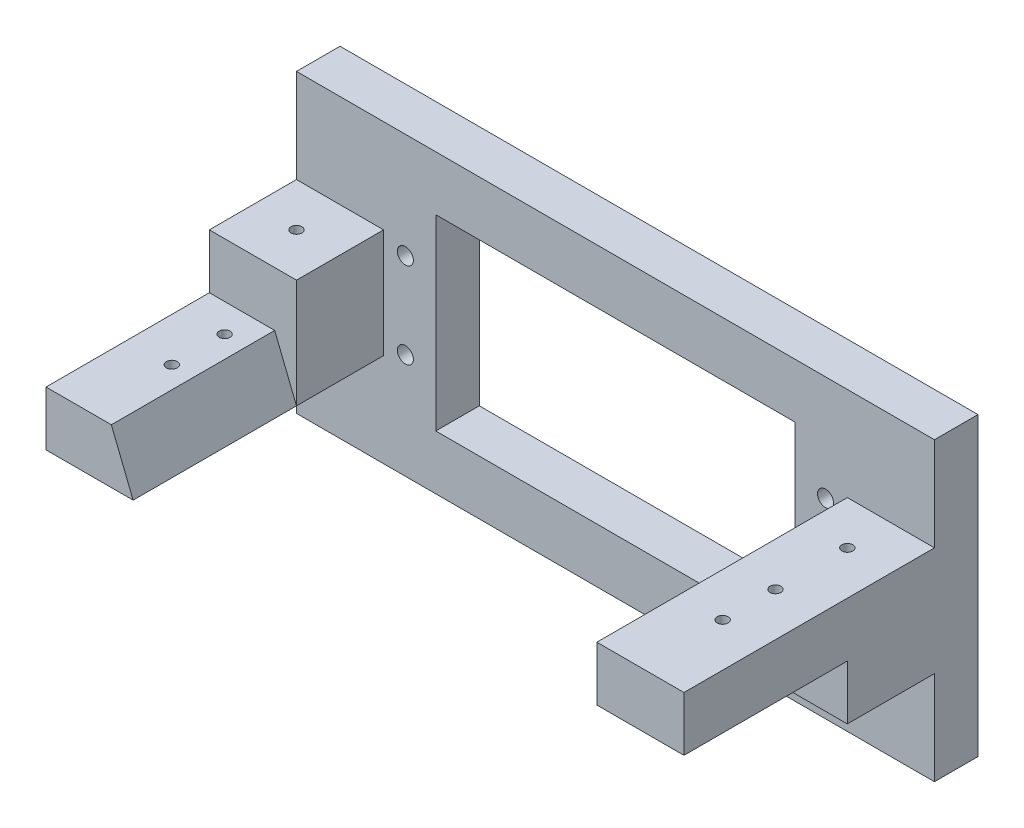
ISO-10303-21;
HEADER;
FILE_DESCRIPTION(('STEP AP214'),'2;1');
FILE_NAME('part.step','',(''),(''),'','','');
FILE_SCHEMA(('AUTOMOTIVE_DESIGN { 1 0 10303 214 1 1 1 1 }'));
ENDSEC;
DATA;
#1=APPLICATION_CONTEXT('core data for automotive mechanical design processes');
#2=APPLICATION_PROTOCOL_DEFINITION('international standard','automotive_design',2000,#1);
#3=PRODUCT_CONTEXT('',#1,'mechanical');
#4=PRODUCT('Part','Part','',(#3));
#5=PRODUCT_RELATED_PRODUCT_CATEGORY('part','',(#4));
#6=PRODUCT_DEFINITION_FORMATION('','',#4);
#7=PRODUCT_DEFINITION_CONTEXT('part definition',#1,'design');
#8=PRODUCT_DEFINITION('design','',#6,#7);
#9=PRODUCT_DEFINITION_SHAPE('','',#8);
#10=(LENGTH_UNIT() NAMED_UNIT(*) SI_UNIT(.MILLI.,.METRE.));
#11=(NAMED_UNIT(*) PLANE_ANGLE_UNIT() SI_UNIT($,.RADIAN.));
#12=(NAMED_UNIT(*) SI_UNIT($,.STERADIAN.) SOLID_ANGLE_UNIT());
#13=UNCERTAINTY_MEASURE_WITH_UNIT(LENGTH_MEASURE(1.E-05),#10,'distance_accuracy_value','');
#14=(GEOMETRIC_REPRESENTATION_CONTEXT(3) GLOBAL_UNCERTAINTY_ASSIGNED_CONTEXT((#13)) GLOBAL_UNIT_ASSIGNED_CONTEXT((#10,
#11,#12)) REPRESENTATION_CONTEXT('',''));
#15=CARTESIAN_POINT('',(0.,0.,0.));
#16=DIRECTION('',(0.,0.,1.));
#17=DIRECTION('',(1.,0.,0.));
#18=AXIS2_PLACEMENT_3D('',#15,#16,#17);
#19=CARTESIAN_POINT('',(0.,0.,15.24));
#20=DIRECTION('',(0.,0.,-1.));
#21=DIRECTION('',(-1.,0.,0.));
#22=AXIS2_PLACEMENT_3D('',#19,#20,#21);
#23=PLANE('',#22);
#24=DIRECTION('',(1.,0.,0.));
#25=VECTOR('',#24,1.);
#26=CARTESIAN_POINT('',(54.34457,23.622,15.24));
#27=LINE('',#26,#25);
#28=CARTESIAN_POINT('',(54.34457,23.622,15.24));
#29=VERTEX_POINT('',#28);
#30=CARTESIAN_POINT('',(64.50457,23.622,15.24));
#31=VERTEX_POINT('',#30);
#32=EDGE_CURVE('E63',#29,#31,#27,.T.);
#33=ORIENTED_EDGE('',*,*,#32,.F.);
#34=DIRECTION('',(0.,-1.,0.));
#35=VECTOR('',#34,1.);
#36=CARTESIAN_POINT('',(54.34457,17.272,15.24));
#37=LINE('',#36,#35);
#38=CARTESIAN_POINT('',(54.34457,17.272,15.24));
#39=VERTEX_POINT('',#38);
#40=EDGE_CURVE('E220',#29,#39,#37,.T.);
#41=ORIENTED_EDGE('',*,*,#40,.T.);
#42=DIRECTION('',(1.,0.,0.));
#43=VECTOR('',#42,1.);
#44=CARTESIAN_POINT('',(54.34457,17.272,15.24));
#45=LINE('',#44,#43);
#46=CARTESIAN_POINT('',(64.50457,17.272,15.24));
#47=VERTEX_POINT('',#46);
#48=EDGE_CURVE('E229',#39,#47,#45,.T.);
#49=ORIENTED_EDGE('',*,*,#48,.T.);
#50=DIRECTION('',(0.,1.,0.));
#51=VECTOR('',#50,1.);
#52=CARTESIAN_POINT('',(64.50457,17.272,15.24));
#53=LINE('',#52,#51);
#54=EDGE_CURVE('E217',#47,#31,#53,.T.);
#55=ORIENTED_EDGE('',*,*,#54,.T.);
#56=EDGE_LOOP('',(#33,#41,#49,#55));
#57=FACE_BOUND('',#56,.T.);
#58=ADVANCED_FACE('F37',(#57),#23,.F.);
#59=CARTESIAN_POINT('',(0.,0.,15.24));
#60=DIRECTION('',(0.,0.,-1.));
#61=DIRECTION('',(-1.,0.,0.));
#62=AXIS2_PLACEMENT_3D('',#59,#60,#61);
#63=PLANE('',#62);
#64=DIRECTION('',(-1.,0.,0.));
#65=VECTOR('',#64,1.);
#66=CARTESIAN_POINT('',(-9.89457000000001,23.622,15.24));
#67=LINE('',#66,#65);
#68=CARTESIAN_POINT('',(-2.27457,23.622,15.24));
#69=VERTEX_POINT('',#68);
#70=CARTESIAN_POINT('',(-9.89457000000001,23.622,15.24));
#71=VERTEX_POINT('',#70);
#72=EDGE_CURVE('E41',#69,#71,#67,.T.);
#73=ORIENTED_EDGE('',*,*,#72,.F.);
#74=DIRECTION('',(0.371390676354104,-0.928476690885259,0.));
#75=VECTOR('',#74,1.);
#76=CARTESIAN_POINT('',(0.265429999999999,17.272,15.24));
#77=LINE('',#76,#75);
#78=CARTESIAN_POINT('',(0.265429999999999,17.272,15.24));
#79=VERTEX_POINT('',#78);
#80=EDGE_CURVE('E178',#69,#79,#77,.T.);
#81=ORIENTED_EDGE('',*,*,#80,.T.);
#82=DIRECTION('',(0.,1.,0.));
#83=VECTOR('',#82,1.);
#84=CARTESIAN_POINT('',(0.265429999999999,17.272,15.24));
#85=LINE('',#84,#83);
#86=CARTESIAN_POINT('',(0.265429999999999,29.972,15.24));
#87=VERTEX_POINT('',#86);
#88=EDGE_CURVE('E212',#79,#87,#85,.T.);
#89=ORIENTED_EDGE('',*,*,#88,.T.);
#90=DIRECTION('',(-1.,0.,0.));
#91=VECTOR('',#90,1.);
#92=CARTESIAN_POINT('',(-9.89457000000001,29.972,15.24));
#93=LINE('',#92,#91);
#94=CARTESIAN_POINT('',(-9.89457000000001,29.972,15.24));
#95=VERTEX_POINT('',#94);
#96=EDGE_CURVE('E266',#87,#95,#93,.T.);
#97=ORIENTED_EDGE('',*,*,#96,.T.);
#98=DIRECTION('',(0.,-1.,0.));
#99=VECTOR('',#98,1.);
#100=CARTESIAN_POINT('',(-9.89457,17.272,15.24));
#101=LINE('',#100,#99);
#102=EDGE_CURVE('E197',#95,#71,#101,.T.);
#103=ORIENTED_EDGE('',*,*,#102,.T.);
#104=EDGE_LOOP('',(#73,#81,#89,#97,#103));
#105=FACE_BOUND('',#104,.T.);
#106=ADVANCED_FACE('F195',(#105),#63,.F.);
#107=CARTESIAN_POINT('',(0.,0.,5.08));
#108=DIRECTION('',(0.,0.,-1.));
#109=DIRECTION('',(-1.,0.,0.));
#110=AXIS2_PLACEMENT_3D('',#107,#108,#109);
#111=PLANE('',#110);
#112=CARTESIAN_POINT('',(51.80457,18.62201,5.08));
#113=DIRECTION('',(0.,0.,1.));
#114=DIRECTION('',(1.,0.,0.));
#115=AXIS2_PLACEMENT_3D('',#112,#113,#114);
#116=CIRCLE('',#115,0.935990000000007);
#117=CARTESIAN_POINT('',(52.74056,18.62201,5.08));
#118=VERTEX_POINT('',#117);
#119=EDGE_CURVE('E354',#118,#118,#116,.T.);
#120=ORIENTED_EDGE('',*,*,#119,.F.);
#121=EDGE_LOOP('',(#120));
#122=FACE_BOUND('',#121,.T.);
#123=CARTESIAN_POINT('',(51.80457,28.62199,5.08));
#124=DIRECTION('',(0.,0.,1.));
#125=DIRECTION('',(1.,0.,0.));
#126=AXIS2_PLACEMENT_3D('',#123,#124,#125);
#127=CIRCLE('',#126,0.935990000000007);
#128=CARTESIAN_POINT('',(52.74056,28.62199,5.08));
#129=VERTEX_POINT('',#128);
#130=EDGE_CURVE('E348',#129,#129,#127,.T.);
#131=ORIENTED_EDGE('',*,*,#130,.F.);
#132=EDGE_LOOP('',(#131));
#133=FACE_BOUND('',#132,.T.);
#134=CARTESIAN_POINT('',(2.80543,18.62201,5.08));
#135=DIRECTION('',(0.,0.,1.));
#136=DIRECTION('',(1.,0.,0.));
#137=AXIS2_PLACEMENT_3D('',#134,#135,#136);
#138=CIRCLE('',#137,0.935990000000001);
#139=CARTESIAN_POINT('',(3.74142,18.62201,5.08));
#140=VERTEX_POINT('',#139);
#141=EDGE_CURVE('E342',#140,#140,#138,.T.);
#142=ORIENTED_EDGE('',*,*,#141,.F.);
#143=EDGE_LOOP('',(#142));
#144=FACE_BOUND('',#143,.T.);
#145=CARTESIAN_POINT('',(2.80543,28.62199,5.08));
#146=DIRECTION('',(0.,0.,1.));
#147=DIRECTION('',(1.,0.,0.));
#148=AXIS2_PLACEMENT_3D('',#145,#146,#147);
#149=CIRCLE('',#148,0.935990000000001);
#150=CARTESIAN_POINT('',(3.74142,28.62199,5.08));
#151=VERTEX_POINT('',#150);
#152=EDGE_CURVE('E336',#151,#151,#149,.T.);
#153=ORIENTED_EDGE('',*,*,#152,.F.);
#154=EDGE_LOOP('',(#153));
#155=FACE_BOUND('',#154,.T.);
#156=DIRECTION('',(0.,-1.,0.));
#157=VECTOR('',#156,1.);
#158=CARTESIAN_POINT('',(6.35,12.7,5.08));
#159=LINE('',#158,#157);
#160=CARTESIAN_POINT('',(6.35,34.544,5.08));
#161=VERTEX_POINT('',#160);
#162=CARTESIAN_POINT('',(6.35,12.7,5.08));
#163=VERTEX_POINT('',#162);
#164=EDGE_CURVE('E318',#161,#163,#159,.T.);
#165=ORIENTED_EDGE('',*,*,#164,.F.);
#166=DIRECTION('',(-1.,0.,0.));
#167=VECTOR('',#166,1.);
#168=CARTESIAN_POINT('',(6.35,34.544,5.08));
#169=LINE('',#168,#167);
#170=CARTESIAN_POINT('',(48.26,34.544,5.08));
#171=VERTEX_POINT('',#170);
#172=EDGE_CURVE('E314',#171,#161,#169,.T.);
#173=ORIENTED_EDGE('',*,*,#172,.F.);
#174=DIRECTION('',(0.,1.,0.));
#175=VECTOR('',#174,1.);
#176=CARTESIAN_POINT('',(48.26,12.7,5.08));
#177=LINE('',#176,#175);
#178=CARTESIAN_POINT('',(48.26,12.7,5.08));
#179=VERTEX_POINT('',#178);
#180=EDGE_CURVE('E330',#179,#171,#177,.T.);
#181=ORIENTED_EDGE('',*,*,#180,.F.);
#182=DIRECTION('',(1.,0.,0.));
#183=VECTOR('',#182,1.);
#184=CARTESIAN_POINT('',(6.35,12.7,5.08));
#185=LINE('',#184,#183);
#186=EDGE_CURVE('E333',#163,#179,#185,.T.);
#187=ORIENTED_EDGE('',*,*,#186,.F.);
#188=EDGE_LOOP('',(#165,#173,#181,#187));
#189=FACE_BOUND('',#188,.T.);
#190=DIRECTION('',(-1.,0.,0.));
#191=VECTOR('',#190,1.);
#192=CARTESIAN_POINT('',(54.34457,29.972,5.08));
#193=LINE('',#192,#191);
#194=CARTESIAN_POINT('',(64.50457,29.972,5.08));
#195=VERTEX_POINT('',#194);
#196=CARTESIAN_POINT('',(54.34457,29.972,5.08));
#197=VERTEX_POINT('',#196);
#198=EDGE_CURVE('E232',#195,#197,#193,.T.);
#199=ORIENTED_EDGE('',*,*,#198,.F.);
#200=DIRECTION('',(0.,1.,0.));
#201=VECTOR('',#200,1.);
#202=CARTESIAN_POINT('',(64.50457,6.35,5.08));
#203=LINE('',#202,#201);
#204=CARTESIAN_POINT('',(64.50457,40.894,5.08));
#205=VERTEX_POINT('',#204);
#206=EDGE_CURVE('E284',#195,#205,#203,.T.);
#207=ORIENTED_EDGE('',*,*,#206,.T.);
#208=DIRECTION('',(1.,0.,0.));
#209=VECTOR('',#208,1.);
#210=CARTESIAN_POINT('',(-5.842,40.894,5.08));
#211=LINE('',#210,#209);
#212=CARTESIAN_POINT('',(-9.89457,40.894,5.08));
#213=VERTEX_POINT('',#212);
#214=EDGE_CURVE('E357',#213,#205,#211,.T.);
#215=ORIENTED_EDGE('',*,*,#214,.F.);
#216=DIRECTION('',(0.,-1.,0.));
#217=VECTOR('',#216,1.);
#218=CARTESIAN_POINT('',(-9.89457,40.894,5.08));
#219=LINE('',#218,#217);
#220=CARTESIAN_POINT('',(-9.89457,29.972,5.08));
#221=VERTEX_POINT('',#220);
#222=EDGE_CURVE('E302',#213,#221,#219,.T.);
#223=ORIENTED_EDGE('',*,*,#222,.T.);
#224=DIRECTION('',(-1.,0.,0.));
#225=VECTOR('',#224,1.);
#226=CARTESIAN_POINT('',(-9.89457000000001,29.972,5.08));
#227=LINE('',#226,#225);
#228=CARTESIAN_POINT('',(0.265429999999999,29.972,5.08));
#229=VERTEX_POINT('',#228);
#230=EDGE_CURVE('E256',#229,#221,#227,.T.);
#231=ORIENTED_EDGE('',*,*,#230,.F.);
#232=DIRECTION('',(0.,1.,0.));
#233=VECTOR('',#232,1.);
#234=CARTESIAN_POINT('',(0.265429999999999,17.272,5.08));
#235=LINE('',#234,#233);
#236=CARTESIAN_POINT('',(0.265429999999999,17.272,5.08));
#237=VERTEX_POINT('',#236);
#238=EDGE_CURVE('E270',#237,#229,#235,.T.);
#239=ORIENTED_EDGE('',*,*,#238,.F.);
#240=DIRECTION('',(1.,0.,0.));
#241=VECTOR('',#240,1.);
#242=CARTESIAN_POINT('',(-9.89457,17.272,5.08));
#243=LINE('',#242,#241);
#244=CARTESIAN_POINT('',(-9.89457,17.272,5.08));
#245=VERTEX_POINT('',#244);
#246=EDGE_CURVE('E251',#245,#237,#243,.T.);
#247=ORIENTED_EDGE('',*,*,#246,.F.);
#248=CARTESIAN_POINT('',(-9.89457,6.35,5.08));
#249=VERTEX_POINT('',#248);
#250=EDGE_CURVE('E291',#245,#249,#219,.T.);
#251=ORIENTED_EDGE('',*,*,#250,.T.);
#252=DIRECTION('',(-1.,0.,0.));
#253=VECTOR('',#252,1.);
#254=CARTESIAN_POINT('',(-4.572,6.35,5.08));
#255=LINE('',#254,#253);
#256=CARTESIAN_POINT('',(64.50457,6.35,5.08));
#257=VERTEX_POINT('',#256);
#258=EDGE_CURVE('E364',#257,#249,#255,.T.);
#259=ORIENTED_EDGE('',*,*,#258,.F.);
#260=CARTESIAN_POINT('',(64.50457,17.272,5.08));
#261=VERTEX_POINT('',#260);
#262=EDGE_CURVE('E281',#257,#261,#203,.T.);
#263=ORIENTED_EDGE('',*,*,#262,.T.);
#264=DIRECTION('',(1.,0.,0.));
#265=VECTOR('',#264,1.);
#266=CARTESIAN_POINT('',(54.34457,17.272,5.08));
#267=LINE('',#266,#265);
#268=CARTESIAN_POINT('',(54.34457,17.272,5.08));
#269=VERTEX_POINT('',#268);
#270=EDGE_CURVE('E221',#269,#261,#267,.T.);
#271=ORIENTED_EDGE('',*,*,#270,.F.);
#272=DIRECTION('',(0.,-1.,0.));
#273=VECTOR('',#272,1.);
#274=CARTESIAN_POINT('',(54.34457,17.272,5.08));
#275=LINE('',#274,#273);
#276=EDGE_CURVE('E235',#197,#269,#275,.T.);
#277=ORIENTED_EDGE('',*,*,#276,.F.);
#278=EDGE_LOOP('',(#199,#207,#215,#223,#231,#239,#247,#251,#259,#263,#271,#277));
#279=FACE_BOUND('',#278,.T.);
#280=ADVANCED_FACE('F387',(#122,#133,#144,#155,#189,#279),#111,.F.);
#281=CARTESIAN_POINT('',(0.,0.,0.));
#282=DIRECTION('',(0.,0.,-1.));
#283=DIRECTION('',(-1.,0.,0.));
#284=AXIS2_PLACEMENT_3D('',#281,#282,#283);
#285=PLANE('',#284);
#286=DIRECTION('',(-1.,0.,0.));
#287=VECTOR('',#286,1.);
#288=CARTESIAN_POINT('',(0.,40.894,0.));
#289=LINE('',#288,#287);
#290=CARTESIAN_POINT('',(64.50457,40.894,0.));
#291=VERTEX_POINT('',#290);
#292=CARTESIAN_POINT('',(-9.89457,40.894,0.));
#293=VERTEX_POINT('',#292);
#294=EDGE_CURVE('E12',#291,#293,#289,.T.);
#295=ORIENTED_EDGE('',*,*,#294,.F.);
#296=DIRECTION('',(0.,1.,0.));
#297=VECTOR('',#296,1.);
#298=CARTESIAN_POINT('',(64.50457,6.35,0.));
#299=LINE('',#298,#297);
#300=CARTESIAN_POINT('',(64.50457,6.35,0.));
#301=VERTEX_POINT('',#300);
#302=EDGE_CURVE('E285',#301,#291,#299,.T.);
#303=ORIENTED_EDGE('',*,*,#302,.F.);
#304=DIRECTION('',(1.,0.,0.));
#305=VECTOR('',#304,1.);
#306=CARTESIAN_POINT('',(0.,6.35,0.));
#307=LINE('',#306,#305);
#308=CARTESIAN_POINT('',(-9.89457,6.35,0.));
#309=VERTEX_POINT('',#308);
#310=EDGE_CURVE('E362',#309,#301,#307,.T.);
#311=ORIENTED_EDGE('',*,*,#310,.F.);
#312=DIRECTION('',(0.,-1.,0.));
#313=VECTOR('',#312,1.);
#314=CARTESIAN_POINT('',(-9.89457,40.894,0.));
#315=LINE('',#314,#313);
#316=EDGE_CURVE('E296',#293,#309,#315,.T.);
#317=ORIENTED_EDGE('',*,*,#316,.F.);
#318=EDGE_LOOP('',(#295,#303,#311,#317));
#319=FACE_BOUND('',#318,.T.);
#320=CARTESIAN_POINT('',(51.80457,18.62201,0.));
#321=DIRECTION('',(0.,0.,1.));
#322=DIRECTION('',(1.,0.,0.));
#323=AXIS2_PLACEMENT_3D('',#320,#321,#322);
#324=CIRCLE('',#323,0.935990000000007);
#325=CARTESIAN_POINT('',(52.74056,18.62201,0.));
#326=VERTEX_POINT('',#325);
#327=EDGE_CURVE('E351',#326,#326,#324,.T.);
#328=ORIENTED_EDGE('',*,*,#327,.T.);
#329=EDGE_LOOP('',(#328));
#330=FACE_BOUND('',#329,.T.);
#331=CARTESIAN_POINT('',(51.80457,28.62199,0.));
#332=DIRECTION('',(0.,0.,1.));
#333=DIRECTION('',(1.,0.,0.));
#334=AXIS2_PLACEMENT_3D('',#331,#332,#333);
#335=CIRCLE('',#334,0.935990000000007);
#336=CARTESIAN_POINT('',(52.74056,28.62199,0.));
#337=VERTEX_POINT('',#336);
#338=EDGE_CURVE('E345',#337,#337,#335,.T.);
#339=ORIENTED_EDGE('',*,*,#338,.T.);
#340=EDGE_LOOP('',(#339));
#341=FACE_BOUND('',#340,.T.);
#342=CARTESIAN_POINT('',(2.80543,18.62201,0.));
#343=DIRECTION('',(0.,0.,1.));
#344=DIRECTION('',(1.,0.,0.));
#345=AXIS2_PLACEMENT_3D('',#342,#343,#344);
#346=CIRCLE('',#345,0.935990000000001);
#347=CARTESIAN_POINT('',(3.74142,18.62201,0.));
#348=VERTEX_POINT('',#347);
#349=EDGE_CURVE('E339',#348,#348,#346,.T.);
#350=ORIENTED_EDGE('',*,*,#349,.T.);
#351=EDGE_LOOP('',(#350));
#352=FACE_BOUND('',#351,.T.);
#353=CARTESIAN_POINT('',(2.80543,28.62199,0.));
#354=DIRECTION('',(0.,0.,1.));
#355=DIRECTION('',(1.,0.,0.));
#356=AXIS2_PLACEMENT_3D('',#353,#354,#355);
#357=CIRCLE('',#356,0.935990000000001);
#358=CARTESIAN_POINT('',(3.74142,28.62199,0.));
#359=VERTEX_POINT('',#358);
#360=EDGE_CURVE('E328',#359,#359,#357,.T.);
#361=ORIENTED_EDGE('',*,*,#360,.T.);
#362=EDGE_LOOP('',(#361));
#363=FACE_BOUND('',#362,.T.);
#364=DIRECTION('',(-1.,0.,0.));
#365=VECTOR('',#364,1.);
#366=CARTESIAN_POINT('',(6.35,34.544,0.));
#367=LINE('',#366,#365);
#368=CARTESIAN_POINT('',(48.26,34.544,0.));
#369=VERTEX_POINT('',#368);
#370=CARTESIAN_POINT('',(6.35,34.544,0.));
#371=VERTEX_POINT('',#370);
#372=EDGE_CURVE('E315',#369,#371,#367,.T.);
#373=ORIENTED_EDGE('',*,*,#372,.T.);
#374=DIRECTION('',(0.,-1.,0.));
#375=VECTOR('',#374,1.);
#376=CARTESIAN_POINT('',(6.35,12.7,0.));
#377=LINE('',#376,#375);
#378=CARTESIAN_POINT('',(6.35,12.7,0.));
#379=VERTEX_POINT('',#378);
#380=EDGE_CURVE('E325',#371,#379,#377,.T.);
#381=ORIENTED_EDGE('',*,*,#380,.T.);
#382=DIRECTION('',(1.,0.,0.));
#383=VECTOR('',#382,1.);
#384=CARTESIAN_POINT('',(6.35,12.7,0.));
#385=LINE('',#384,#383);
#386=CARTESIAN_POINT('',(48.26,12.7,0.));
#387=VERTEX_POINT('',#386);
#388=EDGE_CURVE('E322',#379,#387,#385,.T.);
#389=ORIENTED_EDGE('',*,*,#388,.T.);
#390=DIRECTION('',(0.,1.,0.));
#391=VECTOR('',#390,1.);
#392=CARTESIAN_POINT('',(48.26,12.7,0.));
#393=LINE('',#392,#391);
#394=EDGE_CURVE('E319',#387,#369,#393,.T.);
#395=ORIENTED_EDGE('',*,*,#394,.T.);
#396=EDGE_LOOP('',(#373,#381,#389,#395));
#397=FACE_BOUND('',#396,.T.);
#398=ADVANCED_FACE('F39',(#319,#330,#341,#352,#363,#397),#285,.T.);
#399=CARTESIAN_POINT('',(6.35,12.7,5.08));
#400=DIRECTION('',(1.,0.,0.));
#401=DIRECTION('',(0.,0.,-1.));
#402=AXIS2_PLACEMENT_3D('',#399,#400,#401);
#403=PLANE('',#402);
#404=ORIENTED_EDGE('',*,*,#380,.F.);
#405=DIRECTION('',(0.,0.,-1.));
#406=VECTOR('',#405,1.);
#407=CARTESIAN_POINT('',(6.35,34.544,5.08));
#408=LINE('',#407,#406);
#409=EDGE_CURVE('E311',#161,#371,#408,.T.);
#410=ORIENTED_EDGE('',*,*,#409,.F.);
#411=ORIENTED_EDGE('',*,*,#164,.T.);
#412=DIRECTION('',(0.,0.,-1.));
#413=VECTOR('',#412,1.);
#414=CARTESIAN_POINT('',(6.35,12.7,5.08));
#415=LINE('',#414,#413);
#416=EDGE_CURVE('E47',#163,#379,#415,.T.);
#417=ORIENTED_EDGE('',*,*,#416,.T.);
#418=EDGE_LOOP('',(#404,#410,#411,#417));
#419=FACE_BOUND('',#418,.T.);
#420=ADVANCED_FACE('F675',(#419),#403,.T.);
#421=CARTESIAN_POINT('',(6.35,12.7,5.08));
#422=DIRECTION('',(0.,1.,0.));
#423=DIRECTION('',(0.,0.,1.));
#424=AXIS2_PLACEMENT_3D('',#421,#422,#423);
#425=PLANE('',#424);
#426=ORIENTED_EDGE('',*,*,#388,.F.);
#427=ORIENTED_EDGE('',*,*,#416,.F.);
#428=ORIENTED_EDGE('',*,*,#186,.T.);
#429=DIRECTION('',(0.,0.,-1.));
#430=VECTOR('',#429,1.);
#431=CARTESIAN_POINT('',(48.26,12.7,5.08));
#432=LINE('',#431,#430);
#433=EDGE_CURVE('E307',#179,#387,#432,.T.);
#434=ORIENTED_EDGE('',*,*,#433,.T.);
#435=EDGE_LOOP('',(#426,#427,#428,#434));
#436=FACE_BOUND('',#435,.T.);
#437=ADVANCED_FACE('F735',(#436),#425,.T.);
#438=CARTESIAN_POINT('',(48.26,12.7,5.08));
#439=DIRECTION('',(-1.,0.,0.));
#440=DIRECTION('',(0.,0.,1.));
#441=AXIS2_PLACEMENT_3D('',#438,#439,#440);
#442=PLANE('',#441);
#443=ORIENTED_EDGE('',*,*,#394,.F.);
#444=ORIENTED_EDGE('',*,*,#433,.F.);
#445=ORIENTED_EDGE('',*,*,#180,.T.);
#446=DIRECTION('',(0.,0.,-1.));
#447=VECTOR('',#446,1.);
#448=CARTESIAN_POINT('',(48.26,34.544,5.08));
#449=LINE('',#448,#447);
#450=EDGE_CURVE('E309',#171,#369,#449,.T.);
#451=ORIENTED_EDGE('',*,*,#450,.T.);
#452=EDGE_LOOP('',(#443,#444,#445,#451));
#453=FACE_BOUND('',#452,.T.);
#454=ADVANCED_FACE('F725',(#453),#442,.T.);
#455=CARTESIAN_POINT('',(6.35,34.544,5.08));
#456=DIRECTION('',(0.,-1.,0.));
#457=DIRECTION('',(0.,0.,-1.));
#458=AXIS2_PLACEMENT_3D('',#455,#456,#457);
#459=PLANE('',#458);
#460=ORIENTED_EDGE('',*,*,#372,.F.);
#461=ORIENTED_EDGE('',*,*,#450,.F.);
#462=ORIENTED_EDGE('',*,*,#172,.T.);
#463=ORIENTED_EDGE('',*,*,#409,.T.);
#464=EDGE_LOOP('',(#460,#461,#462,#463));
#465=FACE_BOUND('',#464,.T.);
#466=ADVANCED_FACE('F715',(#465),#459,.T.);
#467=CARTESIAN_POINT('',(2.80543,28.62199,0.));
#468=DIRECTION('',(0.,0.,1.));
#469=DIRECTION('',(1.,0.,0.));
#470=AXIS2_PLACEMENT_3D('',#467,#468,#469);
#471=CYLINDRICAL_SURFACE('',#470,0.935990000000001);
#472=ORIENTED_EDGE('',*,*,#360,.F.);
#473=EDGE_LOOP('',(#472));
#474=FACE_BOUND('',#473,.T.);
#475=ORIENTED_EDGE('',*,*,#152,.T.);
#476=EDGE_LOOP('',(#475));
#477=FACE_BOUND('',#476,.T.);
#478=ADVANCED_FACE('F705',(#474,#477),#471,.F.);
#479=CARTESIAN_POINT('',(2.80543,18.62201,0.));
#480=DIRECTION('',(0.,0.,1.));
#481=DIRECTION('',(1.,0.,0.));
#482=AXIS2_PLACEMENT_3D('',#479,#480,#481);
#483=CYLINDRICAL_SURFACE('',#482,0.935990000000001);
#484=ORIENTED_EDGE('',*,*,#349,.F.);
#485=EDGE_LOOP('',(#484));
#486=FACE_BOUND('',#485,.T.);
#487=ORIENTED_EDGE('',*,*,#141,.T.);
#488=EDGE_LOOP('',(#487));
#489=FACE_BOUND('',#488,.T.);
#490=ADVANCED_FACE('F695',(#486,#489),#483,.F.);
#491=CARTESIAN_POINT('',(51.80457,28.62199,0.));
#492=DIRECTION('',(0.,0.,1.));
#493=DIRECTION('',(1.,0.,0.));
#494=AXIS2_PLACEMENT_3D('',#491,#492,#493);
#495=CYLINDRICAL_SURFACE('',#494,0.935990000000007);
#496=ORIENTED_EDGE('',*,*,#338,.F.);
#497=EDGE_LOOP('',(#496));
#498=FACE_BOUND('',#497,.T.);
#499=ORIENTED_EDGE('',*,*,#130,.T.);
#500=EDGE_LOOP('',(#499));
#501=FACE_BOUND('',#500,.T.);
#502=ADVANCED_FACE('F684',(#498,#501),#495,.F.);
#503=CARTESIAN_POINT('',(51.80457,18.62201,0.));
#504=DIRECTION('',(0.,0.,1.));
#505=DIRECTION('',(1.,0.,0.));
#506=AXIS2_PLACEMENT_3D('',#503,#504,#505);
#507=CYLINDRICAL_SURFACE('',#506,0.935990000000007);
#508=ORIENTED_EDGE('',*,*,#327,.F.);
#509=EDGE_LOOP('',(#508));
#510=FACE_BOUND('',#509,.T.);
#511=ORIENTED_EDGE('',*,*,#119,.T.);
#512=EDGE_LOOP('',(#511));
#513=FACE_BOUND('',#512,.T.);
#514=ADVANCED_FACE('F665',(#510,#513),#507,.F.);
#515=CARTESIAN_POINT('',(-5.842,40.894,-4.99999999997031E-05));
#516=DIRECTION('',(0.,-1.,0.));
#517=DIRECTION('',(0.,0.,-1.));
#518=AXIS2_PLACEMENT_3D('',#515,#516,#517);
#519=PLANE('',#518);
#520=ORIENTED_EDGE('',*,*,#214,.T.);
#521=DIRECTION('',(0.,0.,1.));
#522=VECTOR('',#521,1.);
#523=CARTESIAN_POINT('',(64.50457,40.894,-36.8034987067381));
#524=LINE('',#523,#522);
#525=EDGE_CURVE('E288',#291,#205,#524,.T.);
#526=ORIENTED_EDGE('',*,*,#525,.F.);
#527=ORIENTED_EDGE('',*,*,#294,.T.);
#528=DIRECTION('',(0.,0.,1.));
#529=VECTOR('',#528,1.);
#530=CARTESIAN_POINT('',(-9.89457,40.894,-36.8034987067381));
#531=LINE('',#530,#529);
#532=EDGE_CURVE('E303',#293,#213,#531,.T.);
#533=ORIENTED_EDGE('',*,*,#532,.T.);
#534=EDGE_LOOP('',(#520,#526,#527,#533));
#535=FACE_BOUND('',#534,.T.);
#536=ADVANCED_FACE('F408',(#535),#519,.F.);
#537=CARTESIAN_POINT('',(-4.572,6.35,-4.99999999997031E-05));
#538=DIRECTION('',(0.,1.,0.));
#539=DIRECTION('',(0.,0.,1.));
#540=AXIS2_PLACEMENT_3D('',#537,#538,#539);
#541=PLANE('',#540);
#542=ORIENTED_EDGE('',*,*,#258,.T.);
#543=DIRECTION('',(0.,0.,1.));
#544=VECTOR('',#543,1.);
#545=CARTESIAN_POINT('',(-9.89457,6.35,-36.8034987067381));
#546=LINE('',#545,#544);
#547=EDGE_CURVE('E367',#309,#249,#546,.T.);
#548=ORIENTED_EDGE('',*,*,#547,.F.);
#549=ORIENTED_EDGE('',*,*,#310,.T.);
#550=DIRECTION('',(0.,0.,1.));
#551=VECTOR('',#550,1.);
#552=CARTESIAN_POINT('',(64.50457,6.35,-36.8034987067381));
#553=LINE('',#552,#551);
#554=EDGE_CURVE('E283',#301,#257,#553,.T.);
#555=ORIENTED_EDGE('',*,*,#554,.T.);
#556=EDGE_LOOP('',(#542,#548,#549,#555));
#557=FACE_BOUND('',#556,.T.);
#558=ADVANCED_FACE('F383',(#557),#541,.F.);
#559=CARTESIAN_POINT('',(-9.89457,40.894,-36.8034987067381));
#560=DIRECTION('',(-1.,0.,0.));
#561=DIRECTION('',(0.,-1.,0.));
#562=AXIS2_PLACEMENT_3D('',#559,#560,#561);
#563=PLANE('',#562);
#564=ORIENTED_EDGE('',*,*,#532,.F.);
#565=ORIENTED_EDGE('',*,*,#316,.T.);
#566=ORIENTED_EDGE('',*,*,#547,.T.);
#567=ORIENTED_EDGE('',*,*,#250,.F.);
#568=DIRECTION('',(0.,0.,-1.));
#569=VECTOR('',#568,1.);
#570=CARTESIAN_POINT('',(-9.89457,17.272,15.24));
#571=LINE('',#570,#569);
#572=CARTESIAN_POINT('',(-9.89457000000001,17.272,34.29));
#573=VERTEX_POINT('',#572);
#574=EDGE_CURVE('E280',#573,#245,#571,.T.);
#575=ORIENTED_EDGE('',*,*,#574,.F.);
#576=DIRECTION('',(0.,-1.,0.));
#577=VECTOR('',#576,1.);
#578=CARTESIAN_POINT('',(-9.89457000000001,23.622,34.29));
#579=LINE('',#578,#577);
#580=CARTESIAN_POINT('',(-9.89457000000001,23.622,34.29));
#581=VERTEX_POINT('',#580);
#582=EDGE_CURVE('E435',#581,#573,#579,.T.);
#583=ORIENTED_EDGE('',*,*,#582,.F.);
#584=DIRECTION('',(0.,0.,-1.));
#585=VECTOR('',#584,1.);
#586=CARTESIAN_POINT('',(-9.89457000000001,23.622,39.9821160377119));
#587=LINE('',#586,#585);
#588=EDGE_CURVE('E200',#581,#71,#587,.T.);
#589=ORIENTED_EDGE('',*,*,#588,.T.);
#590=ORIENTED_EDGE('',*,*,#102,.F.);
#591=DIRECTION('',(0.,0.,-1.));
#592=VECTOR('',#591,1.);
#593=CARTESIAN_POINT('',(-9.89457000000001,29.972,15.24));
#594=LINE('',#593,#592);
#595=EDGE_CURVE('E262',#95,#221,#594,.T.);
#596=ORIENTED_EDGE('',*,*,#595,.T.);
#597=ORIENTED_EDGE('',*,*,#222,.F.);
#598=EDGE_LOOP('',(#564,#565,#566,#567,#575,#583,#589,#590,#596,#597));
#599=FACE_BOUND('',#598,.T.);
#600=ADVANCED_FACE('F375',(#599),#563,.T.);
#601=CARTESIAN_POINT('',(64.50457,6.35,-36.8034987067381));
#602=DIRECTION('',(1.,0.,0.));
#603=DIRECTION('',(0.,0.,-1.));
#604=AXIS2_PLACEMENT_3D('',#601,#602,#603);
#605=PLANE('',#604);
#606=ORIENTED_EDGE('',*,*,#554,.F.);
#607=ORIENTED_EDGE('',*,*,#302,.T.);
#608=ORIENTED_EDGE('',*,*,#525,.T.);
#609=ORIENTED_EDGE('',*,*,#206,.F.);
#610=DIRECTION('',(0.,0.,-1.));
#611=VECTOR('',#610,1.);
#612=CARTESIAN_POINT('',(64.50457,29.972,15.24));
#613=LINE('',#612,#611);
#614=CARTESIAN_POINT('',(64.50457,29.972,34.29));
#615=VERTEX_POINT('',#614);
#616=EDGE_CURVE('E248',#615,#195,#613,.T.);
#617=ORIENTED_EDGE('',*,*,#616,.F.);
#618=DIRECTION('',(0.,1.,0.));
#619=VECTOR('',#618,1.);
#620=CARTESIAN_POINT('',(64.50457,23.622,34.29));
#621=LINE('',#620,#619);
#622=CARTESIAN_POINT('',(64.50457,23.622,34.29));
#623=VERTEX_POINT('',#622);
#624=EDGE_CURVE('E428',#623,#615,#621,.T.);
#625=ORIENTED_EDGE('',*,*,#624,.F.);
#626=DIRECTION('',(0.,0.,-1.));
#627=VECTOR('',#626,1.);
#628=CARTESIAN_POINT('',(64.50457,23.622,39.9821160377119));
#629=LINE('',#628,#627);
#630=EDGE_CURVE('E204',#623,#31,#629,.T.);
#631=ORIENTED_EDGE('',*,*,#630,.T.);
#632=ORIENTED_EDGE('',*,*,#54,.F.);
#633=DIRECTION('',(0.,0.,-1.));
#634=VECTOR('',#633,1.);
#635=CARTESIAN_POINT('',(64.50457,17.272,15.24));
#636=LINE('',#635,#634);
#637=EDGE_CURVE('E231',#47,#261,#636,.T.);
#638=ORIENTED_EDGE('',*,*,#637,.T.);
#639=ORIENTED_EDGE('',*,*,#262,.F.);
#640=EDGE_LOOP('',(#606,#607,#608,#609,#617,#625,#631,#632,#638,#639));
#641=FACE_BOUND('',#640,.T.);
#642=ADVANCED_FACE('F410',(#641),#605,.T.);
#643=CARTESIAN_POINT('',(-9.89457,17.272,15.24));
#644=DIRECTION('',(0.,1.,0.));
#645=DIRECTION('',(0.,0.,1.));
#646=AXIS2_PLACEMENT_3D('',#643,#644,#645);
#647=PLANE('',#646);
#648=CARTESIAN_POINT('',(-4.81457,17.272,24.69896));
#649=DIRECTION('',(0.,1.,0.));
#650=DIRECTION('',(0.,0.,1.));
#651=AXIS2_PLACEMENT_3D('',#648,#649,#650);
#652=CIRCLE('',#651,0.634999999999999);
#653=CARTESIAN_POINT('',(-4.81457,17.272,25.33396));
#654=VERTEX_POINT('',#653);
#655=EDGE_CURVE('E451',#654,#654,#652,.T.);
#656=ORIENTED_EDGE('',*,*,#655,.T.);
#657=EDGE_LOOP('',(#656));
#658=FACE_BOUND('',#657,.T.);
#659=CARTESIAN_POINT('',(-4.81457,17.272,18.542));
#660=DIRECTION('',(0.,1.,0.));
#661=DIRECTION('',(0.,0.,1.));
#662=AXIS2_PLACEMENT_3D('',#659,#660,#661);
#663=CIRCLE('',#662,0.634999999999999);
#664=CARTESIAN_POINT('',(-4.81457,17.272,19.177));
#665=VERTEX_POINT('',#664);
#666=EDGE_CURVE('E455',#665,#665,#663,.T.);
#667=ORIENTED_EDGE('',*,*,#666,.T.);
#668=EDGE_LOOP('',(#667));
#669=FACE_BOUND('',#668,.T.);
#670=CARTESIAN_POINT('',(-4.81457,17.272,10.16));
#671=DIRECTION('',(0.,1.,0.));
#672=DIRECTION('',(0.,0.,1.));
#673=AXIS2_PLACEMENT_3D('',#670,#671,#672);
#674=CIRCLE('',#673,0.635000000000001);
#675=CARTESIAN_POINT('',(-4.81457,17.272,10.795));
#676=VERTEX_POINT('',#675);
#677=EDGE_CURVE('E225',#676,#676,#674,.T.);
#678=ORIENTED_EDGE('',*,*,#677,.T.);
#679=EDGE_LOOP('',(#678));
#680=FACE_BOUND('',#679,.T.);
#681=ORIENTED_EDGE('',*,*,#246,.T.);
#682=DIRECTION('',(0.,0.,-1.));
#683=VECTOR('',#682,1.);
#684=CARTESIAN_POINT('',(0.265429999999999,17.272,15.24));
#685=LINE('',#684,#683);
#686=EDGE_CURVE('E278',#79,#237,#685,.T.);
#687=ORIENTED_EDGE('',*,*,#686,.F.);
#688=CARTESIAN_POINT('',(0.265429999999999,17.272,34.29));
#689=VERTEX_POINT('',#688);
#690=EDGE_CURVE('E181',#689,#79,#685,.T.);
#691=ORIENTED_EDGE('',*,*,#690,.F.);
#692=DIRECTION('',(1.,0.,0.));
#693=VECTOR('',#692,1.);
#694=CARTESIAN_POINT('',(-9.89457000000001,17.272,34.29));
#695=LINE('',#694,#693);
#696=EDGE_CURVE('E396',#573,#689,#695,.T.);
#697=ORIENTED_EDGE('',*,*,#696,.F.);
#698=ORIENTED_EDGE('',*,*,#574,.T.);
#699=EDGE_LOOP('',(#681,#687,#691,#697,#698));
#700=FACE_BOUND('',#699,.T.);
#701=ADVANCED_FACE('F394',(#658,#669,#680,#700),#647,.F.);
#702=CARTESIAN_POINT('',(0.265429999999999,17.272,15.24));
#703=DIRECTION('',(-1.,0.,0.));
#704=DIRECTION('',(0.,-1.,0.));
#705=AXIS2_PLACEMENT_3D('',#702,#703,#704);
#706=PLANE('',#705);
#707=ORIENTED_EDGE('',*,*,#88,.F.);
#708=ORIENTED_EDGE('',*,*,#686,.T.);
#709=ORIENTED_EDGE('',*,*,#238,.T.);
#710=DIRECTION('',(0.,0.,-1.));
#711=VECTOR('',#710,1.);
#712=CARTESIAN_POINT('',(0.265429999999999,29.972,15.24));
#713=LINE('',#712,#711);
#714=EDGE_CURVE('E265',#87,#229,#713,.T.);
#715=ORIENTED_EDGE('',*,*,#714,.F.);
#716=EDGE_LOOP('',(#707,#708,#709,#715));
#717=FACE_BOUND('',#716,.T.);
#718=ADVANCED_FACE('F402',(#717),#706,.F.);
#719=CARTESIAN_POINT('',(-9.89457000000001,29.972,15.24));
#720=DIRECTION('',(0.,-1.,0.));
#721=DIRECTION('',(1.,0.,0.));
#722=AXIS2_PLACEMENT_3D('',#719,#720,#721);
#723=PLANE('',#722);
#724=CARTESIAN_POINT('',(-4.81457,29.972,10.16));
#725=DIRECTION('',(0.,1.,0.));
#726=DIRECTION('',(-1.,0.,0.));
#727=AXIS2_PLACEMENT_3D('',#724,#725,#726);
#728=CIRCLE('',#727,0.635000000000001);
#729=CARTESIAN_POINT('',(-5.44957,29.972,10.16));
#730=VERTEX_POINT('',#729);
#731=EDGE_CURVE('E259',#730,#730,#728,.T.);
#732=ORIENTED_EDGE('',*,*,#731,.F.);
#733=EDGE_LOOP('',(#732));
#734=FACE_BOUND('',#733,.T.);
#735=ORIENTED_EDGE('',*,*,#230,.T.);
#736=ORIENTED_EDGE('',*,*,#595,.F.);
#737=ORIENTED_EDGE('',*,*,#96,.F.);
#738=ORIENTED_EDGE('',*,*,#714,.T.);
#739=EDGE_LOOP('',(#735,#736,#737,#738));
#740=FACE_BOUND('',#739,.T.);
#741=ADVANCED_FACE('F405',(#734,#740),#723,.F.);
#742=CARTESIAN_POINT('',(54.34457,29.972,15.24));
#743=DIRECTION('',(0.,-1.,0.));
#744=DIRECTION('',(1.,0.,0.));
#745=AXIS2_PLACEMENT_3D('',#742,#743,#744);
#746=PLANE('',#745);
#747=CARTESIAN_POINT('',(59.42457,29.972,24.69896));
#748=DIRECTION('',(0.,-1.,0.));
#749=DIRECTION('',(1.,0.,0.));
#750=AXIS2_PLACEMENT_3D('',#747,#748,#749);
#751=CIRCLE('',#750,0.634999999999995);
#752=CARTESIAN_POINT('',(60.05957,29.972,24.69896));
#753=VERTEX_POINT('',#752);
#754=EDGE_CURVE('E443',#753,#753,#751,.T.);
#755=ORIENTED_EDGE('',*,*,#754,.T.);
#756=EDGE_LOOP('',(#755));
#757=FACE_BOUND('',#756,.T.);
#758=CARTESIAN_POINT('',(59.42457,29.972,18.542));
#759=DIRECTION('',(0.,-1.,0.));
#760=DIRECTION('',(1.,0.,0.));
#761=AXIS2_PLACEMENT_3D('',#758,#759,#760);
#762=CIRCLE('',#761,0.634999999999995);
#763=CARTESIAN_POINT('',(60.05957,29.972,18.542));
#764=VERTEX_POINT('',#763);
#765=EDGE_CURVE('E447',#764,#764,#762,.T.);
#766=ORIENTED_EDGE('',*,*,#765,.T.);
#767=EDGE_LOOP('',(#766));
#768=FACE_BOUND('',#767,.T.);
#769=CARTESIAN_POINT('',(59.42457,29.972,10.16));
#770=DIRECTION('',(0.,1.,0.));
#771=DIRECTION('',(-1.,0.,0.));
#772=AXIS2_PLACEMENT_3D('',#769,#770,#771);
#773=CIRCLE('',#772,0.634999999999995);
#774=CARTESIAN_POINT('',(58.78957,29.972,10.16));
#775=VERTEX_POINT('',#774);
#776=EDGE_CURVE('E199',#775,#775,#773,.T.);
#777=ORIENTED_EDGE('',*,*,#776,.F.);
#778=EDGE_LOOP('',(#777));
#779=FACE_BOUND('',#778,.T.);
#780=ORIENTED_EDGE('',*,*,#198,.T.);
#781=DIRECTION('',(0.,0.,-1.));
#782=VECTOR('',#781,1.);
#783=CARTESIAN_POINT('',(54.34457,29.972,15.24));
#784=LINE('',#783,#782);
#785=CARTESIAN_POINT('',(54.34457,29.972,34.29));
#786=VERTEX_POINT('',#785);
#787=EDGE_CURVE('E245',#786,#197,#784,.T.);
#788=ORIENTED_EDGE('',*,*,#787,.F.);
#789=DIRECTION('',(-1.,0.,0.));
#790=VECTOR('',#789,1.);
#791=CARTESIAN_POINT('',(64.50457,29.972,34.29));
#792=LINE('',#791,#790);
#793=EDGE_CURVE('E185',#615,#786,#792,.T.);
#794=ORIENTED_EDGE('',*,*,#793,.F.);
#795=ORIENTED_EDGE('',*,*,#616,.T.);
#796=EDGE_LOOP('',(#780,#788,#794,#795));
#797=FACE_BOUND('',#796,.T.);
#798=ADVANCED_FACE('F425',(#757,#768,#779,#797),#746,.F.);
#799=CARTESIAN_POINT('',(54.34457,17.272,15.24));
#800=DIRECTION('',(1.,0.,0.));
#801=DIRECTION('',(0.,0.,-1.));
#802=AXIS2_PLACEMENT_3D('',#799,#800,#801);
#803=PLANE('',#802);
#804=ORIENTED_EDGE('',*,*,#276,.T.);
#805=DIRECTION('',(0.,0.,-1.));
#806=VECTOR('',#805,1.);
#807=CARTESIAN_POINT('',(54.34457,17.272,15.24));
#808=LINE('',#807,#806);
#809=EDGE_CURVE('E242',#39,#269,#808,.T.);
#810=ORIENTED_EDGE('',*,*,#809,.F.);
#811=ORIENTED_EDGE('',*,*,#40,.F.);
#812=DIRECTION('',(0.,0.,-1.));
#813=VECTOR('',#812,1.);
#814=CARTESIAN_POINT('',(54.34457,23.622,39.9821160377119));
#815=LINE('',#814,#813);
#816=CARTESIAN_POINT('',(54.34457,23.622,34.29));
#817=VERTEX_POINT('',#816);
#818=EDGE_CURVE('E458',#817,#29,#815,.T.);
#819=ORIENTED_EDGE('',*,*,#818,.F.);
#820=DIRECTION('',(0.,-1.,0.));
#821=VECTOR('',#820,1.);
#822=CARTESIAN_POINT('',(54.34457,29.972,34.29));
#823=LINE('',#822,#821);
#824=EDGE_CURVE('E421',#786,#817,#823,.T.);
#825=ORIENTED_EDGE('',*,*,#824,.F.);
#826=ORIENTED_EDGE('',*,*,#787,.T.);
#827=EDGE_LOOP('',(#804,#810,#811,#819,#825,#826));
#828=FACE_BOUND('',#827,.T.);
#829=ADVANCED_FACE('F418',(#828),#803,.F.);
#830=CARTESIAN_POINT('',(54.34457,17.272,15.24));
#831=DIRECTION('',(0.,1.,0.));
#832=DIRECTION('',(-1.,0.,0.));
#833=AXIS2_PLACEMENT_3D('',#830,#831,#832);
#834=PLANE('',#833);
#835=CARTESIAN_POINT('',(59.42457,17.272,10.16));
#836=DIRECTION('',(0.,1.,0.));
#837=DIRECTION('',(-1.,0.,0.));
#838=AXIS2_PLACEMENT_3D('',#835,#836,#837);
#839=CIRCLE('',#838,0.634999999999995);
#840=CARTESIAN_POINT('',(58.78957,17.272,10.16));
#841=VERTEX_POINT('',#840);
#842=EDGE_CURVE('E202',#841,#841,#839,.T.);
#843=ORIENTED_EDGE('',*,*,#842,.T.);
#844=EDGE_LOOP('',(#843));
#845=FACE_BOUND('',#844,.T.);
#846=ORIENTED_EDGE('',*,*,#270,.T.);
#847=ORIENTED_EDGE('',*,*,#637,.F.);
#848=ORIENTED_EDGE('',*,*,#48,.F.);
#849=ORIENTED_EDGE('',*,*,#809,.T.);
#850=EDGE_LOOP('',(#846,#847,#848,#849));
#851=FACE_BOUND('',#850,.T.);
#852=ADVANCED_FACE('F415',(#845,#851),#834,.F.);
#853=CARTESIAN_POINT('',(-4.81456999999999,6.34997499999997,10.16));
#854=DIRECTION('',(0.,1.,0.));
#855=DIRECTION('',(-1.,0.,0.));
#856=AXIS2_PLACEMENT_3D('',#853,#854,#855);
#857=CYLINDRICAL_SURFACE('',#856,0.635000000000001);
#858=ORIENTED_EDGE('',*,*,#731,.T.);
#859=EDGE_LOOP('',(#858));
#860=FACE_BOUND('',#859,.T.);
#861=ORIENTED_EDGE('',*,*,#677,.F.);
#862=EDGE_LOOP('',(#861));
#863=FACE_BOUND('',#862,.T.);
#864=ADVANCED_FACE('F498',(#860,#863),#857,.F.);
#865=CARTESIAN_POINT('',(59.42457,6.34997499999999,10.16));
#866=DIRECTION('',(0.,1.,0.));
#867=DIRECTION('',(-1.,0.,0.));
#868=AXIS2_PLACEMENT_3D('',#865,#866,#867);
#869=CYLINDRICAL_SURFACE('',#868,0.634999999999995);
#870=ORIENTED_EDGE('',*,*,#776,.T.);
#871=EDGE_LOOP('',(#870));
#872=FACE_BOUND('',#871,.T.);
#873=ORIENTED_EDGE('',*,*,#842,.F.);
#874=EDGE_LOOP('',(#873));
#875=FACE_BOUND('',#874,.T.);
#876=ADVANCED_FACE('F495',(#872,#875),#869,.F.);
#877=CARTESIAN_POINT('',(-9.89457000000001,23.622,39.9821160377119));
#878=DIRECTION('',(0.,-1.,0.));
#879=DIRECTION('',(0.,0.,-1.));
#880=AXIS2_PLACEMENT_3D('',#877,#878,#879);
#881=PLANE('',#880);
#882=CARTESIAN_POINT('',(-4.81457,23.622,24.69896));
#883=DIRECTION('',(0.,-1.,0.));
#884=DIRECTION('',(0.,0.,-1.));
#885=AXIS2_PLACEMENT_3D('',#882,#883,#884);
#886=CIRCLE('',#885,0.634999999999999);
#887=CARTESIAN_POINT('',(-4.81457,23.622,24.06396));
#888=VERTEX_POINT('',#887);
#889=EDGE_CURVE('E450',#888,#888,#886,.T.);
#890=ORIENTED_EDGE('',*,*,#889,.T.);
#891=EDGE_LOOP('',(#890));
#892=FACE_BOUND('',#891,.T.);
#893=CARTESIAN_POINT('',(-4.81457,23.622,18.542));
#894=DIRECTION('',(0.,-1.,0.));
#895=DIRECTION('',(0.,0.,-1.));
#896=AXIS2_PLACEMENT_3D('',#893,#894,#895);
#897=CIRCLE('',#896,0.634999999999999);
#898=CARTESIAN_POINT('',(-4.81457,23.622,17.907));
#899=VERTEX_POINT('',#898);
#900=EDGE_CURVE('E454',#899,#899,#897,.T.);
#901=ORIENTED_EDGE('',*,*,#900,.T.);
#902=EDGE_LOOP('',(#901));
#903=FACE_BOUND('',#902,.T.);
#904=DIRECTION('',(-1.,0.,0.));
#905=VECTOR('',#904,1.);
#906=CARTESIAN_POINT('',(0.265429999999999,23.622,34.29));
#907=LINE('',#906,#905);
#908=CARTESIAN_POINT('',(-2.27457,23.622,34.29));
#909=VERTEX_POINT('',#908);
#910=EDGE_CURVE('E192',#909,#581,#907,.T.);
#911=ORIENTED_EDGE('',*,*,#910,.F.);
#912=DIRECTION('',(0.,0.,1.));
#913=VECTOR('',#912,1.);
#914=CARTESIAN_POINT('',(-2.27457,23.622,8.40084069493918));
#915=LINE('',#914,#913);
#916=EDGE_CURVE('E55',#69,#909,#915,.T.);
#917=ORIENTED_EDGE('',*,*,#916,.F.);
#918=ORIENTED_EDGE('',*,*,#72,.T.);
#919=ORIENTED_EDGE('',*,*,#588,.F.);
#920=EDGE_LOOP('',(#911,#917,#918,#919));
#921=FACE_BOUND('',#920,.T.);
#922=ADVANCED_FACE('F189',(#892,#903,#921),#881,.F.);
#923=CARTESIAN_POINT('',(54.34457,23.622,39.9821160377119));
#924=DIRECTION('',(0.,1.,0.));
#925=DIRECTION('',(0.,0.,1.));
#926=AXIS2_PLACEMENT_3D('',#923,#924,#925);
#927=PLANE('',#926);
#928=CARTESIAN_POINT('',(59.42457,23.622,24.69896));
#929=DIRECTION('',(0.,1.,0.));
#930=DIRECTION('',(0.,0.,1.));
#931=AXIS2_PLACEMENT_3D('',#928,#929,#930);
#932=CIRCLE('',#931,0.634999999999995);
#933=CARTESIAN_POINT('',(59.42457,23.622,25.33396));
#934=VERTEX_POINT('',#933);
#935=EDGE_CURVE('E442',#934,#934,#932,.T.);
#936=ORIENTED_EDGE('',*,*,#935,.T.);
#937=EDGE_LOOP('',(#936));
#938=FACE_BOUND('',#937,.T.);
#939=CARTESIAN_POINT('',(59.42457,23.622,18.542));
#940=DIRECTION('',(0.,1.,0.));
#941=DIRECTION('',(0.,0.,1.));
#942=AXIS2_PLACEMENT_3D('',#939,#940,#941);
#943=CIRCLE('',#942,0.634999999999995);
#944=CARTESIAN_POINT('',(59.42457,23.622,19.177));
#945=VERTEX_POINT('',#944);
#946=EDGE_CURVE('E446',#945,#945,#943,.T.);
#947=ORIENTED_EDGE('',*,*,#946,.T.);
#948=EDGE_LOOP('',(#947));
#949=FACE_BOUND('',#948,.T.);
#950=ORIENTED_EDGE('',*,*,#630,.F.);
#951=DIRECTION('',(1.,0.,0.));
#952=VECTOR('',#951,1.);
#953=CARTESIAN_POINT('',(54.34457,23.622,34.29));
#954=LINE('',#953,#952);
#955=EDGE_CURVE('E433',#817,#623,#954,.T.);
#956=ORIENTED_EDGE('',*,*,#955,.F.);
#957=ORIENTED_EDGE('',*,*,#818,.T.);
#958=ORIENTED_EDGE('',*,*,#32,.T.);
#959=EDGE_LOOP('',(#950,#956,#957,#958));
#960=FACE_BOUND('',#959,.T.);
#961=ADVANCED_FACE('F477',(#938,#949,#960),#927,.F.);
#962=CARTESIAN_POINT('',(-4.81457,6.34997499999999,18.542));
#963=DIRECTION('',(0.,1.,0.));
#964=DIRECTION('',(0.,0.,1.));
#965=AXIS2_PLACEMENT_3D('',#962,#963,#964);
#966=CYLINDRICAL_SURFACE('',#965,0.634999999999999);
#967=ORIENTED_EDGE('',*,*,#900,.F.);
#968=EDGE_LOOP('',(#967));
#969=FACE_BOUND('',#968,.T.);
#970=ORIENTED_EDGE('',*,*,#666,.F.);
#971=EDGE_LOOP('',(#970));
#972=FACE_BOUND('',#971,.T.);
#973=ADVANCED_FACE('F525',(#969,#972),#966,.F.);
#974=CARTESIAN_POINT('',(-4.81457,6.34997499999999,24.69896));
#975=DIRECTION('',(0.,1.,0.));
#976=DIRECTION('',(0.,0.,1.));
#977=AXIS2_PLACEMENT_3D('',#974,#975,#976);
#978=CYLINDRICAL_SURFACE('',#977,0.634999999999999);
#979=ORIENTED_EDGE('',*,*,#889,.F.);
#980=EDGE_LOOP('',(#979));
#981=FACE_BOUND('',#980,.T.);
#982=ORIENTED_EDGE('',*,*,#655,.F.);
#983=EDGE_LOOP('',(#982));
#984=FACE_BOUND('',#983,.T.);
#985=ADVANCED_FACE('F528',(#981,#984),#978,.F.);
#986=CARTESIAN_POINT('',(59.42457,6.34997499999999,18.542));
#987=DIRECTION('',(0.,1.,0.));
#988=DIRECTION('',(0.,0.,1.));
#989=AXIS2_PLACEMENT_3D('',#986,#987,#988);
#990=CYLINDRICAL_SURFACE('',#989,0.634999999999995);
#991=ORIENTED_EDGE('',*,*,#946,.F.);
#992=EDGE_LOOP('',(#991));
#993=FACE_BOUND('',#992,.T.);
#994=ORIENTED_EDGE('',*,*,#765,.F.);
#995=EDGE_LOOP('',(#994));
#996=FACE_BOUND('',#995,.T.);
#997=ADVANCED_FACE('F484',(#993,#996),#990,.F.);
#998=CARTESIAN_POINT('',(59.42457,6.34997499999999,24.69896));
#999=DIRECTION('',(0.,1.,0.));
#1000=DIRECTION('',(0.,0.,1.));
#1001=AXIS2_PLACEMENT_3D('',#998,#999,#1000);
#1002=CYLINDRICAL_SURFACE('',#1001,0.634999999999995);
#1003=ORIENTED_EDGE('',*,*,#935,.F.);
#1004=EDGE_LOOP('',(#1003));
#1005=FACE_BOUND('',#1004,.T.);
#1006=ORIENTED_EDGE('',*,*,#754,.F.);
#1007=EDGE_LOOP('',(#1006));
#1008=FACE_BOUND('',#1007,.T.);
#1009=ADVANCED_FACE('F480',(#1005,#1008),#1002,.F.);
#1010=CARTESIAN_POINT('',(0.,0.,34.29));
#1011=DIRECTION('',(0.,0.,1.));
#1012=DIRECTION('',(1.,0.,0.));
#1013=AXIS2_PLACEMENT_3D('',#1010,#1011,#1012);
#1014=PLANE('',#1013);
#1015=DIRECTION('',(0.371390676354104,-0.928476690885259,0.));
#1016=VECTOR('',#1015,1.);
#1017=CARTESIAN_POINT('',(0.265429999999999,17.272,34.29));
#1018=LINE('',#1017,#1016);
#1019=EDGE_CURVE('E193',#909,#689,#1018,.T.);
#1020=ORIENTED_EDGE('',*,*,#1019,.F.);
#1021=ORIENTED_EDGE('',*,*,#910,.T.);
#1022=ORIENTED_EDGE('',*,*,#582,.T.);
#1023=ORIENTED_EDGE('',*,*,#696,.T.);
#1024=EDGE_LOOP('',(#1020,#1021,#1022,#1023));
#1025=FACE_BOUND('',#1024,.T.);
#1026=ADVANCED_FACE('F483',(#1025),#1014,.T.);
#1027=CARTESIAN_POINT('',(0.,0.,34.29));
#1028=DIRECTION('',(0.,0.,1.));
#1029=DIRECTION('',(1.,0.,0.));
#1030=AXIS2_PLACEMENT_3D('',#1027,#1028,#1029);
#1031=PLANE('',#1030);
#1032=ORIENTED_EDGE('',*,*,#793,.T.);
#1033=ORIENTED_EDGE('',*,*,#824,.T.);
#1034=ORIENTED_EDGE('',*,*,#955,.T.);
#1035=ORIENTED_EDGE('',*,*,#624,.T.);
#1036=EDGE_LOOP('',(#1032,#1033,#1034,#1035));
#1037=FACE_BOUND('',#1036,.T.);
#1038=ADVANCED_FACE('F431',(#1037),#1031,.T.);
#1039=CARTESIAN_POINT('',(0.265429999999999,17.272,8.40084069493918));
#1040=DIRECTION('',(-0.928476690885259,-0.371390676354104,0.));
#1041=DIRECTION('',(0.371390676354104,-0.928476690885259,0.));
#1042=AXIS2_PLACEMENT_3D('',#1039,#1040,#1041);
#1043=PLANE('',#1042);
#1044=ORIENTED_EDGE('',*,*,#916,.T.);
#1045=ORIENTED_EDGE('',*,*,#1019,.T.);
#1046=ORIENTED_EDGE('',*,*,#690,.T.);
#1047=ORIENTED_EDGE('',*,*,#80,.F.);
#1048=EDGE_LOOP('',(#1044,#1045,#1046,#1047));
#1049=FACE_BOUND('',#1048,.T.);
#1050=ADVANCED_FACE('F179',(#1049),#1043,.F.);
#1051=CLOSED_SHELL('',(#58,#106,#280,#398,#420,#437,#454,#466,#478,#490,#502,#514,#536,#558,
#600,#642,#701,#718,#741,#798,#829,#852,#864,#876,#922,#961,#973,#985,#997,#1009,#1026,#1038,#1050));
#1052=MANIFOLD_SOLID_BREP('B2',#1051);
#1053=ADVANCED_BREP_SHAPE_REPRESENTATION('',(#18,#1052),#14);
#1054=SHAPE_DEFINITION_REPRESENTATION(#9,#1053);
ENDSEC;
END-ISO-10303-21;
